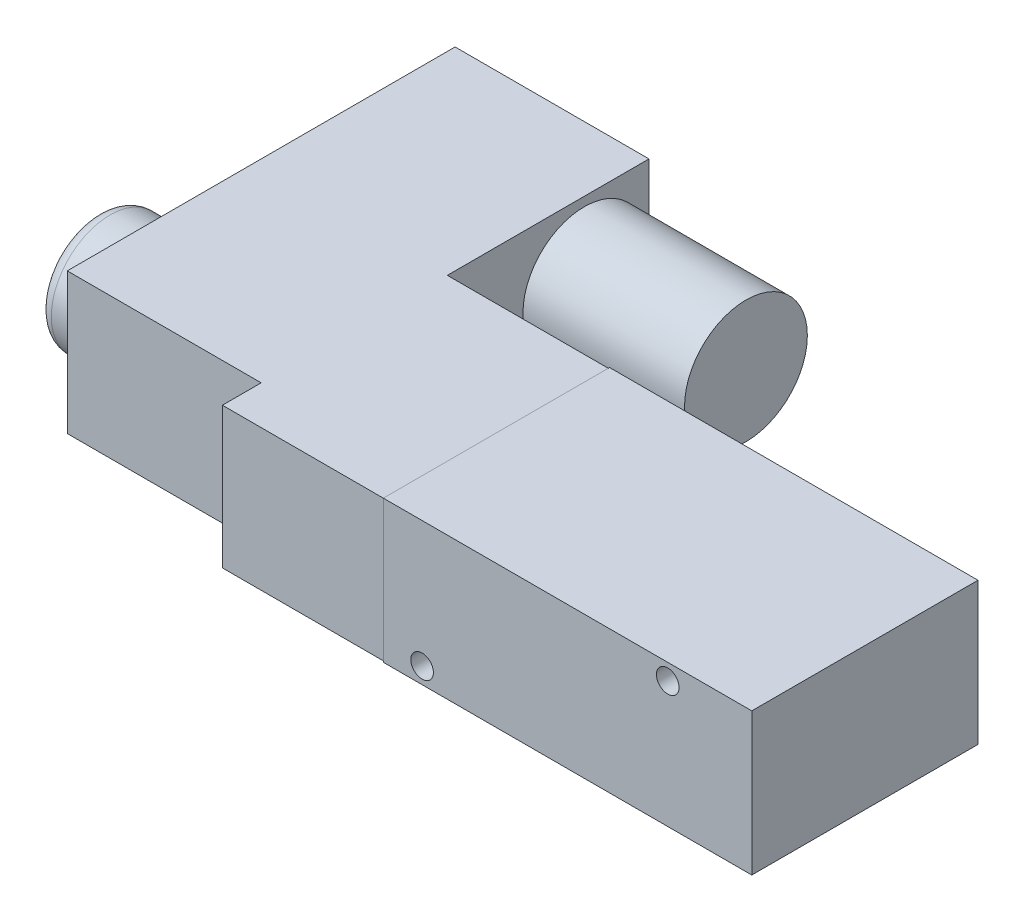
ISO-10303-21;
HEADER;
FILE_DESCRIPTION(('STEP AP214'),'2;1');
FILE_NAME('part.step','',(''),(''),'','','');
FILE_SCHEMA(('AUTOMOTIVE_DESIGN { 1 0 10303 214 1 1 1 1 }'));
ENDSEC;
DATA;
#1=APPLICATION_CONTEXT('core data for automotive mechanical design processes');
#2=APPLICATION_PROTOCOL_DEFINITION('international standard','automotive_design',2000,#1);
#3=PRODUCT_CONTEXT('',#1,'mechanical');
#4=PRODUCT('Part','Part','',(#3));
#5=PRODUCT_RELATED_PRODUCT_CATEGORY('part','',(#4));
#6=PRODUCT_DEFINITION_FORMATION('','',#4);
#7=PRODUCT_DEFINITION_CONTEXT('part definition',#1,'design');
#8=PRODUCT_DEFINITION('design','',#6,#7);
#9=PRODUCT_DEFINITION_SHAPE('','',#8);
#10=(LENGTH_UNIT() NAMED_UNIT(*) SI_UNIT(.MILLI.,.METRE.));
#11=(NAMED_UNIT(*) PLANE_ANGLE_UNIT() SI_UNIT($,.RADIAN.));
#12=(NAMED_UNIT(*) SI_UNIT($,.STERADIAN.) SOLID_ANGLE_UNIT());
#13=UNCERTAINTY_MEASURE_WITH_UNIT(LENGTH_MEASURE(1.E-05),#10,'distance_accuracy_value','');
#14=(GEOMETRIC_REPRESENTATION_CONTEXT(3) GLOBAL_UNCERTAINTY_ASSIGNED_CONTEXT((#13)) GLOBAL_UNIT_ASSIGNED_CONTEXT((#10,
#11,#12)) REPRESENTATION_CONTEXT('',''));
#15=CARTESIAN_POINT('',(0.,0.,0.));
#16=DIRECTION('',(0.,0.,1.));
#17=DIRECTION('',(1.,0.,0.));
#18=AXIS2_PLACEMENT_3D('',#15,#16,#17);
#19=CARTESIAN_POINT('',(-80.,-10.9,28.9));
#20=DIRECTION('',(-1.,0.,0.));
#21=DIRECTION('',(0.,0.,1.));
#22=AXIS2_PLACEMENT_3D('',#19,#20,#21);
#23=PLANE('',#22);
#24=DIRECTION('',(0.,0.,1.));
#25=VECTOR('',#24,1.);
#26=CARTESIAN_POINT('',(-80.,-10.9,-31.1));
#27=LINE('',#26,#25);
#28=CARTESIAN_POINT('',(-80.,-10.9,-31.1));
#29=VERTEX_POINT('',#28);
#30=CARTESIAN_POINT('',(-80.,-10.9,28.9));
#31=VERTEX_POINT('',#30);
#32=EDGE_CURVE('E141',#29,#31,#27,.T.);
#33=ORIENTED_EDGE('',*,*,#32,.T.);
#34=DIRECTION('',(0.,1.,0.));
#35=VECTOR('',#34,1.);
#36=CARTESIAN_POINT('',(-80.,-10.9,28.9));
#37=LINE('',#36,#35);
#38=CARTESIAN_POINT('',(-80.,10.9,28.9));
#39=VERTEX_POINT('',#38);
#40=EDGE_CURVE('E131',#31,#39,#37,.T.);
#41=ORIENTED_EDGE('',*,*,#40,.T.);
#42=DIRECTION('',(0.,0.,-1.));
#43=VECTOR('',#42,1.);
#44=CARTESIAN_POINT('',(-80.,10.9,-31.1));
#45=LINE('',#44,#43);
#46=CARTESIAN_POINT('',(-80.,10.9,-31.1));
#47=VERTEX_POINT('',#46);
#48=EDGE_CURVE('E140',#39,#47,#45,.T.);
#49=ORIENTED_EDGE('',*,*,#48,.T.);
#50=DIRECTION('',(0.,-1.,0.));
#51=VECTOR('',#50,1.);
#52=CARTESIAN_POINT('',(-80.,-10.9,-31.1));
#53=LINE('',#52,#51);
#54=EDGE_CURVE('E146',#47,#29,#53,.T.);
#55=ORIENTED_EDGE('',*,*,#54,.T.);
#56=EDGE_LOOP('',(#33,#41,#49,#55));
#57=FACE_BOUND('',#56,.T.);
#58=CARTESIAN_POINT('',(-80.,0.,16.2802986746531));
#59=DIRECTION('',(-1.,0.,0.));
#60=DIRECTION('',(0.,0.,1.));
#61=AXIS2_PLACEMENT_3D('',#58,#59,#60);
#62=CIRCLE('',#61,9.08413951220275);
#63=CARTESIAN_POINT('',(-80.,0.,25.3644381868558));
#64=VERTEX_POINT('',#63);
#65=EDGE_CURVE('E208',#64,#64,#62,.T.);
#66=ORIENTED_EDGE('',*,*,#65,.F.);
#67=EDGE_LOOP('',(#66));
#68=FACE_BOUND('',#67,.T.);
#69=ADVANCED_FACE('F36',(#57,#68),#23,.T.);
#70=CARTESIAN_POINT('',(-50.,-10.9,28.9));
#71=DIRECTION('',(-1.,0.,0.));
#72=DIRECTION('',(0.,0.,1.));
#73=AXIS2_PLACEMENT_3D('',#70,#71,#72);
#74=PLANE('',#73);
#75=DIRECTION('',(0.,0.,-1.));
#76=VECTOR('',#75,1.);
#77=CARTESIAN_POINT('',(-50.,10.9,-31.1));
#78=LINE('',#77,#76);
#79=CARTESIAN_POINT('',(-50.,10.9,0.1));
#80=VERTEX_POINT('',#79);
#81=CARTESIAN_POINT('',(-50.,10.9,-31.1));
#82=VERTEX_POINT('',#81);
#83=EDGE_CURVE('E187',#80,#82,#78,.T.);
#84=ORIENTED_EDGE('',*,*,#83,.F.);
#85=DIRECTION('',(0.,-1.,0.));
#86=VECTOR('',#85,1.);
#87=CARTESIAN_POINT('',(-50.,10.9,0.1));
#88=LINE('',#87,#86);
#89=CARTESIAN_POINT('',(-50.,-10.9,0.1));
#90=VERTEX_POINT('',#89);
#91=EDGE_CURVE('E167',#80,#90,#88,.T.);
#92=ORIENTED_EDGE('',*,*,#91,.T.);
#93=DIRECTION('',(0.,0.,1.));
#94=VECTOR('',#93,1.);
#95=CARTESIAN_POINT('',(-50.,-10.9,-31.1));
#96=LINE('',#95,#94);
#97=CARTESIAN_POINT('',(-50.,-10.9,-31.1));
#98=VERTEX_POINT('',#97);
#99=EDGE_CURVE('E188',#98,#90,#96,.T.);
#100=ORIENTED_EDGE('',*,*,#99,.F.);
#101=DIRECTION('',(0.,-1.,0.));
#102=VECTOR('',#101,1.);
#103=CARTESIAN_POINT('',(-50.,-10.9,-31.1));
#104=LINE('',#103,#102);
#105=EDGE_CURVE('E150',#82,#98,#104,.T.);
#106=ORIENTED_EDGE('',*,*,#105,.F.);
#107=EDGE_LOOP('',(#84,#92,#100,#106));
#108=FACE_BOUND('',#107,.T.);
#109=CARTESIAN_POINT('',(-50.,0.,-21.1));
#110=DIRECTION('',(-1.,0.,0.));
#111=DIRECTION('',(0.,0.,1.));
#112=AXIS2_PLACEMENT_3D('',#109,#110,#111);
#113=CIRCLE('',#112,9.5);
#114=CARTESIAN_POINT('',(-50.,0.,-11.6));
#115=VERTEX_POINT('',#114);
#116=EDGE_CURVE('E314',#115,#115,#113,.F.);
#117=ORIENTED_EDGE('',*,*,#116,.F.);
#118=EDGE_LOOP('',(#117));
#119=FACE_BOUND('',#118,.T.);
#120=ADVANCED_FACE('F214',(#108,#119),#74,.F.);
#121=CARTESIAN_POINT('',(-25.,11.,35.));
#122=DIRECTION('',(1.,0.,0.));
#123=DIRECTION('',(0.,1.,0.));
#124=AXIS2_PLACEMENT_3D('',#121,#122,#123);
#125=PLANE('',#124);
#126=DIRECTION('',(0.,-1.,0.));
#127=VECTOR('',#126,1.);
#128=CARTESIAN_POINT('',(-25.,11.,0.));
#129=LINE('',#128,#127);
#130=CARTESIAN_POINT('',(-25.,11.,0.));
#131=VERTEX_POINT('',#130);
#132=CARTESIAN_POINT('',(-25.,-11.,0.));
#133=VERTEX_POINT('',#132);
#134=EDGE_CURVE('E308',#131,#133,#129,.T.);
#135=ORIENTED_EDGE('',*,*,#134,.T.);
#136=DIRECTION('',(0.,0.,-1.));
#137=VECTOR('',#136,1.);
#138=CARTESIAN_POINT('',(-25.,-11.,35.));
#139=LINE('',#138,#137);
#140=CARTESIAN_POINT('',(-25.,-11.,35.));
#141=VERTEX_POINT('',#140);
#142=EDGE_CURVE('E315',#141,#133,#139,.T.);
#143=ORIENTED_EDGE('',*,*,#142,.F.);
#144=DIRECTION('',(0.,-1.,0.));
#145=VECTOR('',#144,1.);
#146=CARTESIAN_POINT('',(-25.,11.,35.));
#147=LINE('',#146,#145);
#148=CARTESIAN_POINT('',(-25.,11.,35.));
#149=VERTEX_POINT('',#148);
#150=EDGE_CURVE('E313',#149,#141,#147,.T.);
#151=ORIENTED_EDGE('',*,*,#150,.F.);
#152=DIRECTION('',(0.,0.,-1.));
#153=VECTOR('',#152,1.);
#154=CARTESIAN_POINT('',(-25.,11.,35.));
#155=LINE('',#154,#153);
#156=EDGE_CURVE('E300',#149,#131,#155,.T.);
#157=ORIENTED_EDGE('',*,*,#156,.T.);
#158=EDGE_LOOP('',(#135,#143,#151,#157));
#159=FACE_BOUND('',#158,.T.);
#160=DIRECTION('',(0.,0.,-1.));
#161=VECTOR('',#160,1.);
#162=CARTESIAN_POINT('',(-25.,10.9,34.9));
#163=LINE('',#162,#161);
#164=CARTESIAN_POINT('',(-25.,10.9,34.9));
#165=VERTEX_POINT('',#164);
#166=CARTESIAN_POINT('',(-25.,10.9,0.100000000000003));
#167=VERTEX_POINT('',#166);
#168=EDGE_CURVE('E156',#165,#167,#163,.T.);
#169=ORIENTED_EDGE('',*,*,#168,.F.);
#170=DIRECTION('',(0.,1.,0.));
#171=VECTOR('',#170,1.);
#172=CARTESIAN_POINT('',(-25.,-10.9,34.9));
#173=LINE('',#172,#171);
#174=CARTESIAN_POINT('',(-25.,-10.9,34.9));
#175=VERTEX_POINT('',#174);
#176=EDGE_CURVE('E369',#175,#165,#173,.T.);
#177=ORIENTED_EDGE('',*,*,#176,.F.);
#178=DIRECTION('',(0.,0.,1.));
#179=VECTOR('',#178,1.);
#180=CARTESIAN_POINT('',(-25.,-10.9,0.1));
#181=LINE('',#180,#179);
#182=CARTESIAN_POINT('',(-25.,-10.9,0.100000000000003));
#183=VERTEX_POINT('',#182);
#184=EDGE_CURVE('E372',#183,#175,#181,.T.);
#185=ORIENTED_EDGE('',*,*,#184,.F.);
#186=DIRECTION('',(0.,-1.,0.));
#187=VECTOR('',#186,1.);
#188=CARTESIAN_POINT('',(-25.,10.9,0.1));
#189=LINE('',#188,#187);
#190=EDGE_CURVE('E59',#167,#183,#189,.T.);
#191=ORIENTED_EDGE('',*,*,#190,.F.);
#192=EDGE_LOOP('',(#169,#177,#185,#191));
#193=FACE_BOUND('',#192,.T.);
#194=ADVANCED_FACE('F219',(#159,#193),#125,.F.);
#195=CARTESIAN_POINT('',(-25.,11.,35.));
#196=DIRECTION('',(0.,-1.,0.));
#197=DIRECTION('',(0.,0.,-1.));
#198=AXIS2_PLACEMENT_3D('',#195,#196,#197);
#199=PLANE('',#198);
#200=DIRECTION('',(-1.,0.,0.));
#201=VECTOR('',#200,1.);
#202=CARTESIAN_POINT('',(-25.,11.,0.));
#203=LINE('',#202,#201);
#204=CARTESIAN_POINT('',(32.,11.,0.));
#205=VERTEX_POINT('',#204);
#206=EDGE_CURVE('E298',#205,#131,#203,.T.);
#207=ORIENTED_EDGE('',*,*,#206,.T.);
#208=ORIENTED_EDGE('',*,*,#156,.F.);
#209=DIRECTION('',(-1.,0.,0.));
#210=VECTOR('',#209,1.);
#211=CARTESIAN_POINT('',(-25.,11.,35.));
#212=LINE('',#211,#210);
#213=CARTESIAN_POINT('',(32.,11.,35.));
#214=VERTEX_POINT('',#213);
#215=EDGE_CURVE('E319',#214,#149,#212,.T.);
#216=ORIENTED_EDGE('',*,*,#215,.F.);
#217=DIRECTION('',(0.,0.,1.));
#218=VECTOR('',#217,1.);
#219=CARTESIAN_POINT('',(32.,11.,0.));
#220=LINE('',#219,#218);
#221=EDGE_CURVE('E303',#205,#214,#220,.T.);
#222=ORIENTED_EDGE('',*,*,#221,.F.);
#223=EDGE_LOOP('',(#207,#208,#216,#222));
#224=FACE_BOUND('',#223,.T.);
#225=ADVANCED_FACE('F288',(#224),#199,.F.);
#226=CARTESIAN_POINT('',(-25.,-11.,35.));
#227=DIRECTION('',(0.,1.,0.));
#228=DIRECTION('',(0.,0.,1.));
#229=AXIS2_PLACEMENT_3D('',#226,#227,#228);
#230=PLANE('',#229);
#231=DIRECTION('',(1.,0.,0.));
#232=VECTOR('',#231,1.);
#233=CARTESIAN_POINT('',(-25.,-11.,0.));
#234=LINE('',#233,#232);
#235=CARTESIAN_POINT('',(32.,-11.,0.));
#236=VERTEX_POINT('',#235);
#237=EDGE_CURVE('E317',#133,#236,#234,.T.);
#238=ORIENTED_EDGE('',*,*,#237,.T.);
#239=DIRECTION('',(0.,0.,-1.));
#240=VECTOR('',#239,1.);
#241=CARTESIAN_POINT('',(32.,-11.,35.));
#242=LINE('',#241,#240);
#243=CARTESIAN_POINT('',(32.,-11.,35.));
#244=VERTEX_POINT('',#243);
#245=EDGE_CURVE('E359',#244,#236,#242,.T.);
#246=ORIENTED_EDGE('',*,*,#245,.F.);
#247=DIRECTION('',(1.,0.,0.));
#248=VECTOR('',#247,1.);
#249=CARTESIAN_POINT('',(-25.,-11.,35.));
#250=LINE('',#249,#248);
#251=EDGE_CURVE('E323',#141,#244,#250,.T.);
#252=ORIENTED_EDGE('',*,*,#251,.F.);
#253=ORIENTED_EDGE('',*,*,#142,.T.);
#254=EDGE_LOOP('',(#238,#246,#252,#253));
#255=FACE_BOUND('',#254,.T.);
#256=ADVANCED_FACE('F281',(#255),#230,.F.);
#257=CARTESIAN_POINT('',(25.,-11.,35.));
#258=DIRECTION('',(0.,0.,1.));
#259=DIRECTION('',(1.,0.,0.));
#260=AXIS2_PLACEMENT_3D('',#257,#258,#259);
#261=PLANE('',#260);
#262=CARTESIAN_POINT('',(-19.,-8.5,35.));
#263=DIRECTION('',(0.,0.,1.));
#264=DIRECTION('',(1.,0.,0.));
#265=AXIS2_PLACEMENT_3D('',#262,#263,#264);
#266=CIRCLE('',#265,1.75);
#267=CARTESIAN_POINT('',(-17.25,-8.5,35.));
#268=VERTEX_POINT('',#267);
#269=EDGE_CURVE('E349',#268,#268,#266,.F.);
#270=ORIENTED_EDGE('',*,*,#269,.T.);
#271=EDGE_LOOP('',(#270));
#272=FACE_BOUND('',#271,.T.);
#273=CARTESIAN_POINT('',(19.,8.5,35.));
#274=DIRECTION('',(0.,0.,1.));
#275=DIRECTION('',(1.,0.,0.));
#276=AXIS2_PLACEMENT_3D('',#273,#274,#275);
#277=CIRCLE('',#276,1.75);
#278=CARTESIAN_POINT('',(20.75,8.5,35.));
#279=VERTEX_POINT('',#278);
#280=EDGE_CURVE('E343',#279,#279,#277,.F.);
#281=ORIENTED_EDGE('',*,*,#280,.T.);
#282=EDGE_LOOP('',(#281));
#283=FACE_BOUND('',#282,.T.);
#284=ORIENTED_EDGE('',*,*,#251,.T.);
#285=DIRECTION('',(0.,-1.,0.));
#286=VECTOR('',#285,1.);
#287=CARTESIAN_POINT('',(32.,11.,35.));
#288=LINE('',#287,#286);
#289=EDGE_CURVE('E352',#214,#244,#288,.T.);
#290=ORIENTED_EDGE('',*,*,#289,.F.);
#291=ORIENTED_EDGE('',*,*,#215,.T.);
#292=ORIENTED_EDGE('',*,*,#150,.T.);
#293=EDGE_LOOP('',(#284,#290,#291,#292));
#294=FACE_BOUND('',#293,.T.);
#295=ADVANCED_FACE('F278',(#272,#283,#294),#261,.T.);
#296=CARTESIAN_POINT('',(25.,-11.,0.));
#297=DIRECTION('',(0.,0.,1.));
#298=DIRECTION('',(1.,0.,0.));
#299=AXIS2_PLACEMENT_3D('',#296,#297,#298);
#300=PLANE('',#299);
#301=CARTESIAN_POINT('',(-19.,-8.5,0.));
#302=DIRECTION('',(0.,0.,-1.));
#303=DIRECTION('',(-1.,0.,0.));
#304=AXIS2_PLACEMENT_3D('',#301,#302,#303);
#305=CIRCLE('',#304,1.75);
#306=CARTESIAN_POINT('',(-20.75,-8.5,0.));
#307=VERTEX_POINT('',#306);
#308=EDGE_CURVE('E346',#307,#307,#305,.T.);
#309=ORIENTED_EDGE('',*,*,#308,.F.);
#310=EDGE_LOOP('',(#309));
#311=FACE_BOUND('',#310,.T.);
#312=CARTESIAN_POINT('',(19.,8.5,0.));
#313=DIRECTION('',(0.,0.,-1.));
#314=DIRECTION('',(-1.,0.,0.));
#315=AXIS2_PLACEMENT_3D('',#312,#313,#314);
#316=CIRCLE('',#315,1.75);
#317=CARTESIAN_POINT('',(17.25,8.5,0.));
#318=VERTEX_POINT('',#317);
#319=EDGE_CURVE('E342',#318,#318,#316,.T.);
#320=ORIENTED_EDGE('',*,*,#319,.F.);
#321=EDGE_LOOP('',(#320));
#322=FACE_BOUND('',#321,.T.);
#323=CARTESIAN_POINT('',(-10.,0.999999999999996,0.));
#324=DIRECTION('',(0.,0.,-1.));
#325=DIRECTION('',(-1.,0.,0.));
#326=AXIS2_PLACEMENT_3D('',#323,#324,#325);
#327=CIRCLE('',#326,5.35813);
#328=CARTESIAN_POINT('',(-15.35813,0.999999999999996,0.));
#329=VERTEX_POINT('',#328);
#330=EDGE_CURVE('E339',#329,#329,#327,.T.);
#331=ORIENTED_EDGE('',*,*,#330,.F.);
#332=EDGE_LOOP('',(#331));
#333=FACE_BOUND('',#332,.T.);
#334=CARTESIAN_POINT('',(10.,-1.,0.));
#335=DIRECTION('',(0.,0.,-1.));
#336=DIRECTION('',(-1.,0.,0.));
#337=AXIS2_PLACEMENT_3D('',#334,#335,#336);
#338=CIRCLE('',#337,5.35813);
#339=CARTESIAN_POINT('',(4.64187000000001,-1.,0.));
#340=VERTEX_POINT('',#339);
#341=EDGE_CURVE('E333',#340,#340,#338,.T.);
#342=ORIENTED_EDGE('',*,*,#341,.F.);
#343=EDGE_LOOP('',(#342));
#344=FACE_BOUND('',#343,.T.);
#345=ORIENTED_EDGE('',*,*,#206,.F.);
#346=DIRECTION('',(0.,1.,0.));
#347=VECTOR('',#346,1.);
#348=CARTESIAN_POINT('',(32.,-11.,0.));
#349=LINE('',#348,#347);
#350=EDGE_CURVE('E357',#236,#205,#349,.T.);
#351=ORIENTED_EDGE('',*,*,#350,.F.);
#352=ORIENTED_EDGE('',*,*,#237,.F.);
#353=ORIENTED_EDGE('',*,*,#134,.F.);
#354=EDGE_LOOP('',(#345,#351,#352,#353));
#355=FACE_BOUND('',#354,.T.);
#356=ADVANCED_FACE('F276',(#311,#322,#333,#344,#355),#300,.F.);
#357=CARTESIAN_POINT('',(10.,-1.,31.26));
#358=DIRECTION('',(0.,0.,-1.));
#359=DIRECTION('',(-1.,0.,0.));
#360=AXIS2_PLACEMENT_3D('',#357,#358,#359);
#361=CONICAL_SURFACE('',#360,5.35812999999999,1.02974425867665);
#362=CARTESIAN_POINT('',(10.,-1.,34.4794893086302));
#363=VERTEX_POINT('',#362);
#364=VERTEX_LOOP('',#363);
#365=FACE_BOUND('',#364,.T.);
#366=CARTESIAN_POINT('',(10.,-1.,31.26));
#367=DIRECTION('',(0.,0.,-1.));
#368=DIRECTION('',(-1.,0.,0.));
#369=AXIS2_PLACEMENT_3D('',#366,#367,#368);
#370=CIRCLE('',#369,5.35812999999999);
#371=CARTESIAN_POINT('',(4.64187000000001,-1.,31.26));
#372=VERTEX_POINT('',#371);
#373=EDGE_CURVE('E309',#372,#372,#370,.T.);
#374=ORIENTED_EDGE('',*,*,#373,.T.);
#375=EDGE_LOOP('',(#374));
#376=FACE_BOUND('',#375,.T.);
#377=ADVANCED_FACE('F272',(#365,#376),#361,.F.);
#378=CARTESIAN_POINT('',(10.,-1.,0.));
#379=DIRECTION('',(0.,0.,-1.));
#380=DIRECTION('',(-1.,0.,0.));
#381=AXIS2_PLACEMENT_3D('',#378,#379,#380);
#382=CYLINDRICAL_SURFACE('',#381,5.35813);
#383=ORIENTED_EDGE('',*,*,#373,.F.);
#384=EDGE_LOOP('',(#383));
#385=FACE_BOUND('',#384,.T.);
#386=ORIENTED_EDGE('',*,*,#341,.T.);
#387=EDGE_LOOP('',(#386));
#388=FACE_BOUND('',#387,.T.);
#389=ADVANCED_FACE('F268',(#385,#388),#382,.F.);
#390=CARTESIAN_POINT('',(-10.,0.999999999999996,31.26));
#391=DIRECTION('',(0.,0.,-1.));
#392=DIRECTION('',(-1.,0.,0.));
#393=AXIS2_PLACEMENT_3D('',#390,#391,#392);
#394=CONICAL_SURFACE('',#393,5.35812999999999,1.02974425867665);
#395=CARTESIAN_POINT('',(-10.,0.999999999999996,34.4794893086302));
#396=VERTEX_POINT('',#395);
#397=VERTEX_LOOP('',#396);
#398=FACE_BOUND('',#397,.T.);
#399=CARTESIAN_POINT('',(-10.,0.999999999999996,31.26));
#400=DIRECTION('',(0.,0.,-1.));
#401=DIRECTION('',(-1.,0.,0.));
#402=AXIS2_PLACEMENT_3D('',#399,#400,#401);
#403=CIRCLE('',#402,5.35812999999999);
#404=CARTESIAN_POINT('',(-15.35813,0.999999999999996,31.26));
#405=VERTEX_POINT('',#404);
#406=EDGE_CURVE('E336',#405,#405,#403,.T.);
#407=ORIENTED_EDGE('',*,*,#406,.T.);
#408=EDGE_LOOP('',(#407));
#409=FACE_BOUND('',#408,.T.);
#410=ADVANCED_FACE('F264',(#398,#409),#394,.F.);
#411=CARTESIAN_POINT('',(-10.,0.999999999999996,0.));
#412=DIRECTION('',(0.,0.,-1.));
#413=DIRECTION('',(-1.,0.,0.));
#414=AXIS2_PLACEMENT_3D('',#411,#412,#413);
#415=CYLINDRICAL_SURFACE('',#414,5.35813);
#416=ORIENTED_EDGE('',*,*,#406,.F.);
#417=EDGE_LOOP('',(#416));
#418=FACE_BOUND('',#417,.T.);
#419=ORIENTED_EDGE('',*,*,#330,.T.);
#420=EDGE_LOOP('',(#419));
#421=FACE_BOUND('',#420,.T.);
#422=ADVANCED_FACE('F260',(#418,#421),#415,.F.);
#423=CARTESIAN_POINT('',(19.,8.5,35.001));
#424=DIRECTION('',(0.,0.,-1.));
#425=DIRECTION('',(-1.,0.,0.));
#426=AXIS2_PLACEMENT_3D('',#423,#424,#425);
#427=CYLINDRICAL_SURFACE('',#426,1.75);
#428=ORIENTED_EDGE('',*,*,#280,.F.);
#429=EDGE_LOOP('',(#428));
#430=FACE_BOUND('',#429,.T.);
#431=ORIENTED_EDGE('',*,*,#319,.T.);
#432=EDGE_LOOP('',(#431));
#433=FACE_BOUND('',#432,.T.);
#434=ADVANCED_FACE('F256',(#430,#433),#427,.F.);
#435=CARTESIAN_POINT('',(-19.,-8.5,35.001));
#436=DIRECTION('',(0.,0.,-1.));
#437=DIRECTION('',(-1.,0.,0.));
#438=AXIS2_PLACEMENT_3D('',#435,#436,#437);
#439=CYLINDRICAL_SURFACE('',#438,1.75);
#440=ORIENTED_EDGE('',*,*,#269,.F.);
#441=EDGE_LOOP('',(#440));
#442=FACE_BOUND('',#441,.T.);
#443=ORIENTED_EDGE('',*,*,#308,.T.);
#444=EDGE_LOOP('',(#443));
#445=FACE_BOUND('',#444,.T.);
#446=ADVANCED_FACE('F252',(#442,#445),#439,.F.);
#447=CARTESIAN_POINT('',(32.,-11.,0.));
#448=DIRECTION('',(1.,0.,0.));
#449=DIRECTION('',(0.,1.,0.));
#450=AXIS2_PLACEMENT_3D('',#447,#448,#449);
#451=PLANE('',#450);
#452=ORIENTED_EDGE('',*,*,#245,.T.);
#453=ORIENTED_EDGE('',*,*,#350,.T.);
#454=ORIENTED_EDGE('',*,*,#221,.T.);
#455=ORIENTED_EDGE('',*,*,#289,.T.);
#456=EDGE_LOOP('',(#452,#453,#454,#455));
#457=FACE_BOUND('',#456,.T.);
#458=ADVANCED_FACE('F248',(#457),#451,.T.);
#459=CARTESIAN_POINT('',(-50.,10.9,34.9));
#460=DIRECTION('',(0.,-1.,0.));
#461=DIRECTION('',(1.,0.,0.));
#462=AXIS2_PLACEMENT_3D('',#459,#460,#461);
#463=PLANE('',#462);
#464=ORIENTED_EDGE('',*,*,#168,.T.);
#465=DIRECTION('',(1.,0.,0.));
#466=VECTOR('',#465,1.);
#467=CARTESIAN_POINT('',(-50.,10.9,0.1));
#468=LINE('',#467,#466);
#469=EDGE_CURVE('E362',#80,#167,#468,.T.);
#470=ORIENTED_EDGE('',*,*,#469,.F.);
#471=ORIENTED_EDGE('',*,*,#83,.T.);
#472=DIRECTION('',(1.,0.,0.));
#473=VECTOR('',#472,1.);
#474=CARTESIAN_POINT('',(-80.,10.9,-31.1));
#475=LINE('',#474,#473);
#476=EDGE_CURVE('E160',#47,#82,#475,.T.);
#477=ORIENTED_EDGE('',*,*,#476,.F.);
#478=ORIENTED_EDGE('',*,*,#48,.F.);
#479=DIRECTION('',(1.,0.,0.));
#480=VECTOR('',#479,1.);
#481=CARTESIAN_POINT('',(-80.,10.9,28.9));
#482=LINE('',#481,#480);
#483=CARTESIAN_POINT('',(-50.,10.9,28.9));
#484=VERTEX_POINT('',#483);
#485=EDGE_CURVE('E137',#39,#484,#482,.T.);
#486=ORIENTED_EDGE('',*,*,#485,.T.);
#487=DIRECTION('',(0.,0.,-1.));
#488=VECTOR('',#487,1.);
#489=CARTESIAN_POINT('',(-50.,10.9,34.9));
#490=LINE('',#489,#488);
#491=CARTESIAN_POINT('',(-50.,10.9,34.9));
#492=VERTEX_POINT('',#491);
#493=EDGE_CURVE('E171',#492,#484,#490,.T.);
#494=ORIENTED_EDGE('',*,*,#493,.F.);
#495=DIRECTION('',(1.,0.,0.));
#496=VECTOR('',#495,1.);
#497=CARTESIAN_POINT('',(-50.,10.9,34.9));
#498=LINE('',#497,#496);
#499=EDGE_CURVE('E366',#492,#165,#498,.T.);
#500=ORIENTED_EDGE('',*,*,#499,.T.);
#501=EDGE_LOOP('',(#464,#470,#471,#477,#478,#486,#494,#500));
#502=FACE_BOUND('',#501,.T.);
#503=ADVANCED_FACE('F244',(#502),#463,.F.);
#504=CARTESIAN_POINT('',(-50.,10.9,0.1));
#505=DIRECTION('',(0.,0.,1.));
#506=DIRECTION('',(1.,0.,0.));
#507=AXIS2_PLACEMENT_3D('',#504,#505,#506);
#508=PLANE('',#507);
#509=ORIENTED_EDGE('',*,*,#190,.T.);
#510=DIRECTION('',(1.,0.,0.));
#511=VECTOR('',#510,1.);
#512=CARTESIAN_POINT('',(-50.,-10.9,0.1));
#513=LINE('',#512,#511);
#514=EDGE_CURVE('E172',#90,#183,#513,.T.);
#515=ORIENTED_EDGE('',*,*,#514,.F.);
#516=ORIENTED_EDGE('',*,*,#91,.F.);
#517=ORIENTED_EDGE('',*,*,#469,.T.);
#518=EDGE_LOOP('',(#509,#515,#516,#517));
#519=FACE_BOUND('',#518,.T.);
#520=ADVANCED_FACE('F241',(#519),#508,.F.);
#521=CARTESIAN_POINT('',(-50.,-10.9,0.1));
#522=DIRECTION('',(0.,1.,0.));
#523=DIRECTION('',(-1.,0.,0.));
#524=AXIS2_PLACEMENT_3D('',#521,#522,#523);
#525=PLANE('',#524);
#526=ORIENTED_EDGE('',*,*,#184,.T.);
#527=DIRECTION('',(1.,0.,0.));
#528=VECTOR('',#527,1.);
#529=CARTESIAN_POINT('',(-50.,-10.9,34.9));
#530=LINE('',#529,#528);
#531=CARTESIAN_POINT('',(-50.,-10.9,34.9));
#532=VERTEX_POINT('',#531);
#533=EDGE_CURVE('E363',#532,#175,#530,.T.);
#534=ORIENTED_EDGE('',*,*,#533,.F.);
#535=DIRECTION('',(0.,0.,1.));
#536=VECTOR('',#535,1.);
#537=CARTESIAN_POINT('',(-50.,-10.9,0.1));
#538=LINE('',#537,#536);
#539=CARTESIAN_POINT('',(-50.,-10.9,28.9));
#540=VERTEX_POINT('',#539);
#541=EDGE_CURVE('E155',#540,#532,#538,.T.);
#542=ORIENTED_EDGE('',*,*,#541,.F.);
#543=DIRECTION('',(1.,0.,0.));
#544=VECTOR('',#543,1.);
#545=CARTESIAN_POINT('',(-80.,-10.9,28.9));
#546=LINE('',#545,#544);
#547=EDGE_CURVE('E135',#31,#540,#546,.T.);
#548=ORIENTED_EDGE('',*,*,#547,.F.);
#549=ORIENTED_EDGE('',*,*,#32,.F.);
#550=DIRECTION('',(1.,0.,0.));
#551=VECTOR('',#550,1.);
#552=CARTESIAN_POINT('',(-80.,-10.9,-31.1));
#553=LINE('',#552,#551);
#554=EDGE_CURVE('E202',#29,#98,#553,.T.);
#555=ORIENTED_EDGE('',*,*,#554,.T.);
#556=ORIENTED_EDGE('',*,*,#99,.T.);
#557=ORIENTED_EDGE('',*,*,#514,.T.);
#558=EDGE_LOOP('',(#526,#534,#542,#548,#549,#555,#556,#557));
#559=FACE_BOUND('',#558,.T.);
#560=ADVANCED_FACE('F153',(#559),#525,.F.);
#561=CARTESIAN_POINT('',(-50.,-10.9,34.9));
#562=DIRECTION('',(0.,0.,-1.));
#563=DIRECTION('',(-1.,0.,0.));
#564=AXIS2_PLACEMENT_3D('',#561,#562,#563);
#565=PLANE('',#564);
#566=ORIENTED_EDGE('',*,*,#176,.T.);
#567=ORIENTED_EDGE('',*,*,#499,.F.);
#568=DIRECTION('',(0.,1.,0.));
#569=VECTOR('',#568,1.);
#570=CARTESIAN_POINT('',(-50.,-10.9,34.9));
#571=LINE('',#570,#569);
#572=EDGE_CURVE('E181',#532,#492,#571,.T.);
#573=ORIENTED_EDGE('',*,*,#572,.F.);
#574=ORIENTED_EDGE('',*,*,#533,.T.);
#575=EDGE_LOOP('',(#566,#567,#573,#574));
#576=FACE_BOUND('',#575,.T.);
#577=ADVANCED_FACE('F235',(#576),#565,.F.);
#578=CARTESIAN_POINT('',(-50.,10.9,0.1));
#579=DIRECTION('',(-1.,0.,0.));
#580=DIRECTION('',(0.,0.,1.));
#581=AXIS2_PLACEMENT_3D('',#578,#579,#580);
#582=PLANE('',#581);
#583=DIRECTION('',(0.,1.,0.));
#584=VECTOR('',#583,1.);
#585=CARTESIAN_POINT('',(-50.,-10.9,28.9));
#586=LINE('',#585,#584);
#587=EDGE_CURVE('E51',#540,#484,#586,.T.);
#588=ORIENTED_EDGE('',*,*,#587,.F.);
#589=ORIENTED_EDGE('',*,*,#541,.T.);
#590=ORIENTED_EDGE('',*,*,#572,.T.);
#591=ORIENTED_EDGE('',*,*,#493,.T.);
#592=EDGE_LOOP('',(#588,#589,#590,#591));
#593=FACE_BOUND('',#592,.T.);
#594=ADVANCED_FACE('F232',(#593),#582,.T.);
#595=CARTESIAN_POINT('',(-80.,-10.9,28.9));
#596=DIRECTION('',(0.,0.,-1.));
#597=DIRECTION('',(-1.,0.,0.));
#598=AXIS2_PLACEMENT_3D('',#595,#596,#597);
#599=PLANE('',#598);
#600=ORIENTED_EDGE('',*,*,#587,.T.);
#601=ORIENTED_EDGE('',*,*,#485,.F.);
#602=ORIENTED_EDGE('',*,*,#40,.F.);
#603=ORIENTED_EDGE('',*,*,#547,.T.);
#604=EDGE_LOOP('',(#600,#601,#602,#603));
#605=FACE_BOUND('',#604,.T.);
#606=ADVANCED_FACE('F133',(#605),#599,.F.);
#607=CARTESIAN_POINT('',(-80.,-10.9,-31.1));
#608=DIRECTION('',(0.,0.,1.));
#609=DIRECTION('',(1.,0.,0.));
#610=AXIS2_PLACEMENT_3D('',#607,#608,#609);
#611=PLANE('',#610);
#612=ORIENTED_EDGE('',*,*,#105,.T.);
#613=ORIENTED_EDGE('',*,*,#554,.F.);
#614=ORIENTED_EDGE('',*,*,#54,.F.);
#615=ORIENTED_EDGE('',*,*,#476,.T.);
#616=EDGE_LOOP('',(#612,#613,#614,#615));
#617=FACE_BOUND('',#616,.T.);
#618=ADVANCED_FACE('F226',(#617),#611,.F.);
#619=CARTESIAN_POINT('',(-25.,0.,-21.1));
#620=DIRECTION('',(-1.,0.,0.));
#621=DIRECTION('',(0.,0.,1.));
#622=AXIS2_PLACEMENT_3D('',#619,#620,#621);
#623=CYLINDRICAL_SURFACE('',#622,9.5);
#624=CARTESIAN_POINT('',(-25.,0.,-21.1));
#625=DIRECTION('',(1.,0.,0.));
#626=DIRECTION('',(0.,0.,-1.));
#627=AXIS2_PLACEMENT_3D('',#624,#625,#626);
#628=CIRCLE('',#627,9.5);
#629=CARTESIAN_POINT('',(-25.,0.,-30.6));
#630=VERTEX_POINT('',#629);
#631=EDGE_CURVE('E200',#630,#630,#628,.T.);
#632=ORIENTED_EDGE('',*,*,#631,.F.);
#633=EDGE_LOOP('',(#632));
#634=FACE_BOUND('',#633,.T.);
#635=ORIENTED_EDGE('',*,*,#116,.T.);
#636=EDGE_LOOP('',(#635));
#637=FACE_BOUND('',#636,.T.);
#638=ADVANCED_FACE('F223',(#634,#637),#623,.T.);
#639=CARTESIAN_POINT('',(-25.,0.,-21.1));
#640=DIRECTION('',(1.,0.,0.));
#641=DIRECTION('',(0.,0.,-1.));
#642=AXIS2_PLACEMENT_3D('',#639,#640,#641);
#643=PLANE('',#642);
#644=ORIENTED_EDGE('',*,*,#631,.T.);
#645=EDGE_LOOP('',(#644));
#646=FACE_BOUND('',#645,.T.);
#647=ADVANCED_FACE('F396',(#646),#643,.T.);
#648=CARTESIAN_POINT('',(-88.,0.,16.2802986746531));
#649=DIRECTION('',(1.,0.,0.));
#650=DIRECTION('',(0.,0.,-1.));
#651=AXIS2_PLACEMENT_3D('',#648,#649,#650);
#652=CYLINDRICAL_SURFACE('',#651,9.08413951220275);
#653=CARTESIAN_POINT('',(-86.,0.,16.2802986746531));
#654=DIRECTION('',(-1.,0.,0.));
#655=DIRECTION('',(0.,0.,1.));
#656=AXIS2_PLACEMENT_3D('',#653,#654,#655);
#657=CIRCLE('',#656,9.08413951220275);
#658=CARTESIAN_POINT('',(-86.,0.,25.3644381868558));
#659=VERTEX_POINT('',#658);
#660=EDGE_CURVE('E11',#659,#659,#657,.F.);
#661=ORIENTED_EDGE('',*,*,#660,.T.);
#662=EDGE_LOOP('',(#661));
#663=FACE_BOUND('',#662,.T.);
#664=ORIENTED_EDGE('',*,*,#65,.T.);
#665=EDGE_LOOP('',(#664));
#666=FACE_BOUND('',#665,.T.);
#667=ADVANCED_FACE('F212',(#663,#666),#652,.T.);
#668=CARTESIAN_POINT('',(-88.,0.,16.2802986746531));
#669=DIRECTION('',(-1.,0.,0.));
#670=DIRECTION('',(0.,0.,1.));
#671=AXIS2_PLACEMENT_3D('',#668,#669,#670);
#672=PLANE('',#671);
#673=CARTESIAN_POINT('',(-88.,0.,16.2802986746531));
#674=DIRECTION('',(-1.,0.,0.));
#675=DIRECTION('',(0.,0.,1.));
#676=AXIS2_PLACEMENT_3D('',#673,#674,#675);
#677=CIRCLE('',#676,7.08413951220275);
#678=CARTESIAN_POINT('',(-88.,0.,23.3644381868558));
#679=VERTEX_POINT('',#678);
#680=EDGE_CURVE('E44',#679,#679,#677,.T.);
#681=ORIENTED_EDGE('',*,*,#680,.T.);
#682=EDGE_LOOP('',(#681));
#683=FACE_BOUND('',#682,.T.);
#684=ADVANCED_FACE('F385',(#683),#672,.T.);
#685=CARTESIAN_POINT('',(-86.,0.,16.2802986746531));
#686=DIRECTION('',(-1.,0.,0.));
#687=DIRECTION('',(0.,0.,1.));
#688=AXIS2_PLACEMENT_3D('',#685,#686,#687);
#689=TOROIDAL_SURFACE('',#688,7.08413951220275,2.);
#690=ORIENTED_EDGE('',*,*,#660,.F.);
#691=EDGE_LOOP('',(#690));
#692=FACE_BOUND('',#691,.T.);
#693=ORIENTED_EDGE('',*,*,#680,.F.);
#694=EDGE_LOOP('',(#693));
#695=FACE_BOUND('',#694,.T.);
#696=ADVANCED_FACE('F38',(#692,#695),#689,.T.);
#697=CLOSED_SHELL('',(#69,#120,#194,#225,#256,#295,#356,#377,#389,#410,#422,#434,#446,#458,#503,
#520,#560,#577,#594,#606,#618,#638,#647,#667,#684,#696));
#698=MANIFOLD_SOLID_BREP('B2',#697);
#699=ADVANCED_BREP_SHAPE_REPRESENTATION('',(#18,#698),#14);
#700=SHAPE_DEFINITION_REPRESENTATION(#9,#699);
ENDSEC;
END-ISO-10303-21;
